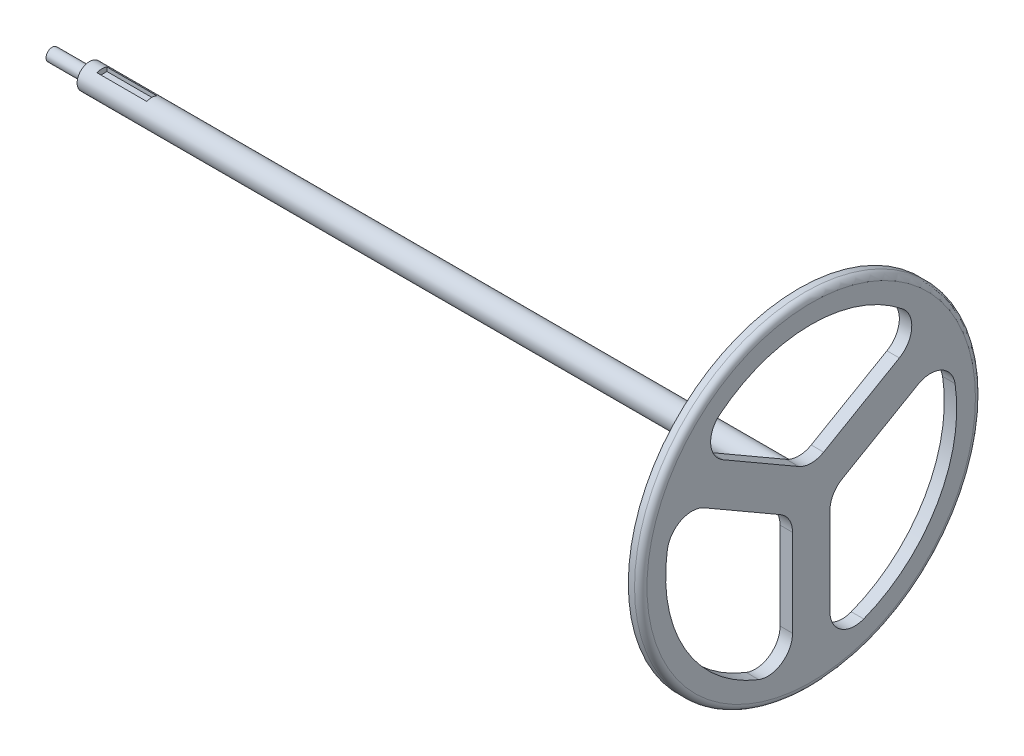
ISO-10303-21;
HEADER;
FILE_DESCRIPTION(('STEP AP214'),'2;1');
FILE_NAME('part.step','',(''),(''),'','','');
FILE_SCHEMA(('AUTOMOTIVE_DESIGN { 1 0 10303 214 1 1 1 1 }'));
ENDSEC;
DATA;
#1=APPLICATION_CONTEXT('core data for automotive mechanical design processes');
#2=APPLICATION_PROTOCOL_DEFINITION('international standard','automotive_design',2000,#1);
#3=PRODUCT_CONTEXT('',#1,'mechanical');
#4=PRODUCT('Part','Part','',(#3));
#5=PRODUCT_RELATED_PRODUCT_CATEGORY('part','',(#4));
#6=PRODUCT_DEFINITION_FORMATION('','',#4);
#7=PRODUCT_DEFINITION_CONTEXT('part definition',#1,'design');
#8=PRODUCT_DEFINITION('design','',#6,#7);
#9=PRODUCT_DEFINITION_SHAPE('','',#8);
#10=(LENGTH_UNIT() NAMED_UNIT(*) SI_UNIT(.MILLI.,.METRE.));
#11=(NAMED_UNIT(*) PLANE_ANGLE_UNIT() SI_UNIT($,.RADIAN.));
#12=(NAMED_UNIT(*) SI_UNIT($,.STERADIAN.) SOLID_ANGLE_UNIT());
#13=UNCERTAINTY_MEASURE_WITH_UNIT(LENGTH_MEASURE(1.E-05),#10,'distance_accuracy_value','');
#14=(GEOMETRIC_REPRESENTATION_CONTEXT(3) GLOBAL_UNCERTAINTY_ASSIGNED_CONTEXT((#13)) GLOBAL_UNIT_ASSIGNED_CONTEXT((#10,
#11,#12)) REPRESENTATION_CONTEXT('',''));
#15=CARTESIAN_POINT('',(0.,0.,0.));
#16=DIRECTION('',(0.,0.,1.));
#17=DIRECTION('',(1.,0.,0.));
#18=AXIS2_PLACEMENT_3D('',#15,#16,#17);
#19=CARTESIAN_POINT('',(-580.,0.,0.));
#20=DIRECTION('',(1.,0.,0.));
#21=DIRECTION('',(0.,0.,-1.));
#22=AXIS2_PLACEMENT_3D('',#19,#20,#21);
#23=CYLINDRICAL_SURFACE('',#22,10.);
#24=DIRECTION('',(1.,0.,0.));
#25=VECTOR('',#24,1.);
#26=CARTESIAN_POINT('',(-580.,9.16515138991168,-4.));
#27=LINE('',#26,#25);
#28=CARTESIAN_POINT('',(-530.,9.16515138991168,-4.));
#29=VERTEX_POINT('',#28);
#30=CARTESIAN_POINT('',(-570.,9.16515138991168,-4.));
#31=VERTEX_POINT('',#30);
#32=EDGE_CURVE('E382',#29,#31,#27,.F.);
#33=ORIENTED_EDGE('',*,*,#32,.F.);
#34=CARTESIAN_POINT('',(-530.,0.,0.));
#35=DIRECTION('',(-1.,0.,0.));
#36=DIRECTION('',(0.,0.,1.));
#37=AXIS2_PLACEMENT_3D('',#34,#35,#36);
#38=CIRCLE('',#37,10.);
#39=CARTESIAN_POINT('',(-530.,9.16515138991168,4.));
#40=VERTEX_POINT('',#39);
#41=EDGE_CURVE('E64',#29,#40,#38,.F.);
#42=ORIENTED_EDGE('',*,*,#41,.T.);
#43=DIRECTION('',(1.,0.,0.));
#44=VECTOR('',#43,1.);
#45=CARTESIAN_POINT('',(-580.,9.16515138991168,4.));
#46=LINE('',#45,#44);
#47=CARTESIAN_POINT('',(-570.,9.16515138991168,4.));
#48=VERTEX_POINT('',#47);
#49=EDGE_CURVE('E384',#48,#40,#46,.T.);
#50=ORIENTED_EDGE('',*,*,#49,.F.);
#51=CARTESIAN_POINT('',(-570.,0.,0.));
#52=DIRECTION('',(-1.,0.,0.));
#53=DIRECTION('',(0.,0.,1.));
#54=AXIS2_PLACEMENT_3D('',#51,#52,#53);
#55=CIRCLE('',#54,10.);
#56=EDGE_CURVE('E378',#31,#48,#55,.F.);
#57=ORIENTED_EDGE('',*,*,#56,.F.);
#58=EDGE_LOOP('',(#33,#42,#50,#57));
#59=FACE_BOUND('',#58,.T.);
#60=CARTESIAN_POINT('',(-580.,0.,0.));
#61=DIRECTION('',(1.,0.,0.));
#62=DIRECTION('',(0.,0.,-1.));
#63=AXIS2_PLACEMENT_3D('',#60,#61,#62);
#64=CIRCLE('',#63,10.);
#65=CARTESIAN_POINT('',(-580.,0.,-10.));
#66=VERTEX_POINT('',#65);
#67=EDGE_CURVE('E374',#66,#66,#64,.T.);
#68=ORIENTED_EDGE('',*,*,#67,.T.);
#69=EDGE_LOOP('',(#68));
#70=FACE_BOUND('',#69,.T.);
#71=CARTESIAN_POINT('',(-10.,0.,0.));
#72=DIRECTION('',(1.,0.,0.));
#73=DIRECTION('',(0.,0.,-1.));
#74=AXIS2_PLACEMENT_3D('',#71,#72,#73);
#75=CIRCLE('',#74,10.);
#76=CARTESIAN_POINT('',(-10.,0.,-10.));
#77=VERTEX_POINT('',#76);
#78=EDGE_CURVE('E221',#77,#77,#75,.T.);
#79=ORIENTED_EDGE('',*,*,#78,.F.);
#80=EDGE_LOOP('',(#79));
#81=FACE_BOUND('',#80,.T.);
#82=ADVANCED_FACE('F41',(#59,#70,#81),#23,.T.);
#83=CARTESIAN_POINT('',(-580.,0.,0.));
#84=DIRECTION('',(1.,0.,0.));
#85=DIRECTION('',(0.,0.,-1.));
#86=AXIS2_PLACEMENT_3D('',#83,#84,#85);
#87=PLANE('',#86);
#88=CARTESIAN_POINT('',(-580.,0.,0.));
#89=DIRECTION('',(-1.,0.,0.));
#90=DIRECTION('',(0.,0.,1.));
#91=AXIS2_PLACEMENT_3D('',#88,#89,#90);
#92=CIRCLE('',#91,5.);
#93=CARTESIAN_POINT('',(-580.,0.,5.));
#94=VERTEX_POINT('',#93);
#95=EDGE_CURVE('E375',#94,#94,#92,.T.);
#96=ORIENTED_EDGE('',*,*,#95,.F.);
#97=EDGE_LOOP('',(#96));
#98=FACE_BOUND('',#97,.T.);
#99=ORIENTED_EDGE('',*,*,#67,.F.);
#100=EDGE_LOOP('',(#99));
#101=FACE_BOUND('',#100,.T.);
#102=ADVANCED_FACE('F400',(#98,#101),#87,.F.);
#103=CARTESIAN_POINT('',(-610.,0.,0.));
#104=DIRECTION('',(1.,0.,0.));
#105=DIRECTION('',(0.,0.,-1.));
#106=AXIS2_PLACEMENT_3D('',#103,#104,#105);
#107=CYLINDRICAL_SURFACE('',#106,5.);
#108=CARTESIAN_POINT('',(-610.,0.,0.));
#109=DIRECTION('',(-1.,0.,0.));
#110=DIRECTION('',(0.,0.,1.));
#111=AXIS2_PLACEMENT_3D('',#108,#109,#110);
#112=CIRCLE('',#111,5.);
#113=CARTESIAN_POINT('',(-610.,0.,5.));
#114=VERTEX_POINT('',#113);
#115=EDGE_CURVE('E369',#114,#114,#112,.T.);
#116=ORIENTED_EDGE('',*,*,#115,.F.);
#117=EDGE_LOOP('',(#116));
#118=FACE_BOUND('',#117,.T.);
#119=ORIENTED_EDGE('',*,*,#95,.T.);
#120=EDGE_LOOP('',(#119));
#121=FACE_BOUND('',#120,.T.);
#122=ADVANCED_FACE('F407',(#118,#121),#107,.T.);
#123=CARTESIAN_POINT('',(-610.,0.,0.));
#124=DIRECTION('',(-1.,0.,0.));
#125=DIRECTION('',(0.,0.,1.));
#126=AXIS2_PLACEMENT_3D('',#123,#124,#125);
#127=PLANE('',#126);
#128=ORIENTED_EDGE('',*,*,#115,.T.);
#129=EDGE_LOOP('',(#128));
#130=FACE_BOUND('',#129,.T.);
#131=ADVANCED_FACE('F415',(#130),#127,.T.);
#132=CARTESIAN_POINT('',(-530.,14.,4.));
#133=DIRECTION('',(0.,0.,1.));
#134=DIRECTION('',(1.,0.,0.));
#135=AXIS2_PLACEMENT_3D('',#132,#133,#134);
#136=PLANE('',#135);
#137=ORIENTED_EDGE('',*,*,#49,.T.);
#138=DIRECTION('',(0.,1.,0.));
#139=VECTOR('',#138,1.);
#140=CARTESIAN_POINT('',(-530.,14.,4.));
#141=LINE('',#140,#139);
#142=CARTESIAN_POINT('',(-530.,6.,4.));
#143=VERTEX_POINT('',#142);
#144=EDGE_CURVE('E353',#143,#40,#141,.T.);
#145=ORIENTED_EDGE('',*,*,#144,.F.);
#146=DIRECTION('',(-1.,0.,0.));
#147=VECTOR('',#146,1.);
#148=CARTESIAN_POINT('',(-530.,6.,4.));
#149=LINE('',#148,#147);
#150=CARTESIAN_POINT('',(-570.,6.,4.));
#151=VERTEX_POINT('',#150);
#152=EDGE_CURVE('E367',#143,#151,#149,.T.);
#153=ORIENTED_EDGE('',*,*,#152,.T.);
#154=DIRECTION('',(0.,1.,0.));
#155=VECTOR('',#154,1.);
#156=CARTESIAN_POINT('',(-570.,14.,4.));
#157=LINE('',#156,#155);
#158=EDGE_CURVE('E319',#151,#48,#157,.T.);
#159=ORIENTED_EDGE('',*,*,#158,.T.);
#160=EDGE_LOOP('',(#137,#145,#153,#159));
#161=FACE_BOUND('',#160,.T.);
#162=ADVANCED_FACE('F419',(#161),#136,.F.);
#163=CARTESIAN_POINT('',(-530.,6.,-4.));
#164=DIRECTION('',(0.,-1.,0.));
#165=DIRECTION('',(0.,0.,-1.));
#166=AXIS2_PLACEMENT_3D('',#163,#164,#165);
#167=PLANE('',#166);
#168=DIRECTION('',(0.,0.,1.));
#169=VECTOR('',#168,1.);
#170=CARTESIAN_POINT('',(-570.,6.,-4.));
#171=LINE('',#170,#169);
#172=CARTESIAN_POINT('',(-570.,6.,-4.));
#173=VERTEX_POINT('',#172);
#174=EDGE_CURVE('E356',#173,#151,#171,.T.);
#175=ORIENTED_EDGE('',*,*,#174,.T.);
#176=ORIENTED_EDGE('',*,*,#152,.F.);
#177=DIRECTION('',(0.,0.,1.));
#178=VECTOR('',#177,1.);
#179=CARTESIAN_POINT('',(-530.,6.,-4.));
#180=LINE('',#179,#178);
#181=CARTESIAN_POINT('',(-530.,6.,-4.));
#182=VERTEX_POINT('',#181);
#183=EDGE_CURVE('E358',#182,#143,#180,.T.);
#184=ORIENTED_EDGE('',*,*,#183,.F.);
#185=DIRECTION('',(-1.,0.,0.));
#186=VECTOR('',#185,1.);
#187=CARTESIAN_POINT('',(-530.,6.,-4.));
#188=LINE('',#187,#186);
#189=EDGE_CURVE('E361',#182,#173,#188,.T.);
#190=ORIENTED_EDGE('',*,*,#189,.T.);
#191=EDGE_LOOP('',(#175,#176,#184,#190));
#192=FACE_BOUND('',#191,.T.);
#193=ADVANCED_FACE('F423',(#192),#167,.F.);
#194=CARTESIAN_POINT('',(-530.,14.,-4.));
#195=DIRECTION('',(0.,0.,-1.));
#196=DIRECTION('',(0.,1.,0.));
#197=AXIS2_PLACEMENT_3D('',#194,#195,#196);
#198=PLANE('',#197);
#199=ORIENTED_EDGE('',*,*,#32,.T.);
#200=DIRECTION('',(0.,-1.,0.));
#201=VECTOR('',#200,1.);
#202=CARTESIAN_POINT('',(-570.,14.,-4.));
#203=LINE('',#202,#201);
#204=EDGE_CURVE('E56',#31,#173,#203,.T.);
#205=ORIENTED_EDGE('',*,*,#204,.T.);
#206=ORIENTED_EDGE('',*,*,#189,.F.);
#207=DIRECTION('',(0.,-1.,0.));
#208=VECTOR('',#207,1.);
#209=CARTESIAN_POINT('',(-530.,14.,-4.));
#210=LINE('',#209,#208);
#211=EDGE_CURVE('E355',#29,#182,#210,.T.);
#212=ORIENTED_EDGE('',*,*,#211,.F.);
#213=EDGE_LOOP('',(#199,#205,#206,#212));
#214=FACE_BOUND('',#213,.T.);
#215=ADVANCED_FACE('F425',(#214),#198,.F.);
#216=CARTESIAN_POINT('',(-530.,0.,0.));
#217=DIRECTION('',(-1.,0.,0.));
#218=DIRECTION('',(0.,0.,1.));
#219=AXIS2_PLACEMENT_3D('',#216,#217,#218);
#220=PLANE('',#219);
#221=ORIENTED_EDGE('',*,*,#211,.T.);
#222=ORIENTED_EDGE('',*,*,#183,.T.);
#223=ORIENTED_EDGE('',*,*,#144,.T.);
#224=ORIENTED_EDGE('',*,*,#41,.F.);
#225=EDGE_LOOP('',(#221,#222,#223,#224));
#226=FACE_BOUND('',#225,.T.);
#227=ADVANCED_FACE('F428',(#226),#220,.T.);
#228=CARTESIAN_POINT('',(-570.,0.,0.));
#229=DIRECTION('',(-1.,0.,0.));
#230=DIRECTION('',(0.,0.,1.));
#231=AXIS2_PLACEMENT_3D('',#228,#229,#230);
#232=PLANE('',#231);
#233=ORIENTED_EDGE('',*,*,#56,.T.);
#234=ORIENTED_EDGE('',*,*,#158,.F.);
#235=ORIENTED_EDGE('',*,*,#174,.F.);
#236=ORIENTED_EDGE('',*,*,#204,.F.);
#237=EDGE_LOOP('',(#233,#234,#235,#236));
#238=FACE_BOUND('',#237,.T.);
#239=ADVANCED_FACE('F433',(#238),#232,.F.);
#240=CARTESIAN_POINT('',(-10.,0.,0.));
#241=DIRECTION('',(1.,0.,0.));
#242=DIRECTION('',(0.,0.,-1.));
#243=AXIS2_PLACEMENT_3D('',#240,#241,#242);
#244=CYLINDRICAL_SURFACE('',#243,117.);
#245=CARTESIAN_POINT('',(0.,0.,0.));
#246=DIRECTION('',(1.,0.,0.));
#247=DIRECTION('',(0.,0.,-1.));
#248=AXIS2_PLACEMENT_3D('',#245,#246,#247);
#249=CIRCLE('',#248,117.);
#250=CARTESIAN_POINT('',(0.,-109.118135811476,-42.2164948453608));
#251=VERTEX_POINT('',#250);
#252=CARTESIAN_POINT('',(0.,17.9985109109211,-115.607325049019));
#253=VERTEX_POINT('',#252);
#254=EDGE_CURVE('E298',#251,#253,#249,.T.);
#255=ORIENTED_EDGE('',*,*,#254,.T.);
#256=DIRECTION('',(1.,0.,0.));
#257=VECTOR('',#256,1.);
#258=CARTESIAN_POINT('',(-10.,17.9985109109211,-115.607325049019));
#259=LINE('',#258,#257);
#260=CARTESIAN_POINT('',(-10.,17.9985109109211,-115.607325049019));
#261=VERTEX_POINT('',#260);
#262=EDGE_CURVE('E316',#261,#253,#259,.T.);
#263=ORIENTED_EDGE('',*,*,#262,.F.);
#264=CARTESIAN_POINT('',(-10.,0.,0.));
#265=DIRECTION('',(1.,0.,0.));
#266=DIRECTION('',(0.,0.,-1.));
#267=AXIS2_PLACEMENT_3D('',#264,#265,#266);
#268=CIRCLE('',#267,117.);
#269=CARTESIAN_POINT('',(-10.,-109.118135811476,-42.2164948453608));
#270=VERTEX_POINT('',#269);
#271=EDGE_CURVE('E250',#270,#261,#268,.T.);
#272=ORIENTED_EDGE('',*,*,#271,.F.);
#273=DIRECTION('',(1.,0.,0.));
#274=VECTOR('',#273,1.);
#275=CARTESIAN_POINT('',(-10.,-109.118135811476,-42.2164948453608));
#276=LINE('',#275,#274);
#277=EDGE_CURVE('E328',#270,#251,#276,.T.);
#278=ORIENTED_EDGE('',*,*,#277,.T.);
#279=EDGE_LOOP('',(#255,#263,#272,#278));
#280=FACE_BOUND('',#279,.T.);
#281=ADVANCED_FACE('F435',(#280),#244,.F.);
#282=CARTESIAN_POINT('',(-10.,14.9218423791397,-95.8453891432035));
#283=DIRECTION('',(1.,0.,0.));
#284=DIRECTION('',(0.,0.,-1.));
#285=AXIS2_PLACEMENT_3D('',#282,#283,#284);
#286=CYLINDRICAL_SURFACE('',#285,20.);
#287=CARTESIAN_POINT('',(0.,14.9218423791397,-95.8453891432035));
#288=DIRECTION('',(1.,0.,0.));
#289=DIRECTION('',(0.,0.,-1.));
#290=AXIS2_PLACEMENT_3D('',#287,#288,#289);
#291=CIRCLE('',#290,20.);
#292=CARTESIAN_POINT('',(0.,32.2423504548284,-85.8453891432034));
#293=VERTEX_POINT('',#292);
#294=EDGE_CURVE('E313',#253,#293,#291,.T.);
#295=ORIENTED_EDGE('',*,*,#294,.T.);
#296=DIRECTION('',(1.,0.,0.));
#297=VECTOR('',#296,1.);
#298=CARTESIAN_POINT('',(-10.,32.2423504548284,-85.8453891432034));
#299=LINE('',#298,#297);
#300=CARTESIAN_POINT('',(-10.,32.2423504548284,-85.8453891432034));
#301=VERTEX_POINT('',#300);
#302=EDGE_CURVE('E320',#301,#293,#299,.T.);
#303=ORIENTED_EDGE('',*,*,#302,.F.);
#304=CARTESIAN_POINT('',(-10.,14.9218423791397,-95.8453891432035));
#305=DIRECTION('',(1.,0.,0.));
#306=DIRECTION('',(0.,0.,-1.));
#307=AXIS2_PLACEMENT_3D('',#304,#305,#306);
#308=CIRCLE('',#307,20.);
#309=EDGE_CURVE('E202',#261,#301,#308,.T.);
#310=ORIENTED_EDGE('',*,*,#309,.F.);
#311=ORIENTED_EDGE('',*,*,#262,.T.);
#312=EDGE_LOOP('',(#295,#303,#310,#311));
#313=FACE_BOUND('',#312,.T.);
#314=ADVANCED_FACE('F489',(#313),#286,.F.);
#315=CARTESIAN_POINT('',(-10.,-12.9903810567665,-7.50000000000007));
#316=DIRECTION('',(0.,-0.866025403784436,-0.500000000000004));
#317=DIRECTION('',(0.,0.500000000000004,-0.866025403784436));
#318=AXIS2_PLACEMENT_3D('',#315,#316,#317);
#319=PLANE('',#318);
#320=DIRECTION('',(0.,0.500000000000004,-0.866025403784436));
#321=VECTOR('',#320,1.);
#322=CARTESIAN_POINT('',(0.,-12.9903810567665,-7.50000000000007));
#323=LINE('',#322,#321);
#324=CARTESIAN_POINT('',(0.,-2.88675134594807,-24.9999999999999));
#325=VERTEX_POINT('',#324);
#326=EDGE_CURVE('E310',#325,#293,#323,.T.);
#327=ORIENTED_EDGE('',*,*,#326,.F.);
#328=DIRECTION('',(1.,0.,0.));
#329=VECTOR('',#328,1.);
#330=CARTESIAN_POINT('',(-10.,-2.88675134594807,-24.9999999999999));
#331=LINE('',#330,#329);
#332=CARTESIAN_POINT('',(-10.,-2.88675134594807,-24.9999999999999));
#333=VERTEX_POINT('',#332);
#334=EDGE_CURVE('E322',#333,#325,#331,.T.);
#335=ORIENTED_EDGE('',*,*,#334,.F.);
#336=DIRECTION('',(0.,0.500000000000004,-0.866025403784436));
#337=VECTOR('',#336,1.);
#338=CARTESIAN_POINT('',(-10.,-12.9903810567665,-7.50000000000007));
#339=LINE('',#338,#337);
#340=EDGE_CURVE('E261',#333,#301,#339,.T.);
#341=ORIENTED_EDGE('',*,*,#340,.T.);
#342=ORIENTED_EDGE('',*,*,#302,.T.);
#343=EDGE_LOOP('',(#327,#335,#341,#342));
#344=FACE_BOUND('',#343,.T.);
#345=ADVANCED_FACE('F500',(#344),#319,.T.);
#346=CARTESIAN_POINT('',(-10.,-20.2072594216368,-35.));
#347=DIRECTION('',(1.,0.,0.));
#348=DIRECTION('',(0.,0.,-1.));
#349=AXIS2_PLACEMENT_3D('',#346,#347,#348);
#350=CYLINDRICAL_SURFACE('',#349,20.);
#351=CARTESIAN_POINT('',(0.,-20.2072594216368,-35.));
#352=DIRECTION('',(1.,0.,0.));
#353=DIRECTION('',(0.,0.,-1.));
#354=AXIS2_PLACEMENT_3D('',#351,#352,#353);
#355=CIRCLE('',#354,20.);
#356=CARTESIAN_POINT('',(0.,-20.2072594216368,-15.));
#357=VERTEX_POINT('',#356);
#358=EDGE_CURVE('E307',#357,#325,#355,.F.);
#359=ORIENTED_EDGE('',*,*,#358,.F.);
#360=DIRECTION('',(1.,0.,0.));
#361=VECTOR('',#360,1.);
#362=CARTESIAN_POINT('',(-10.,-20.2072594216368,-15.));
#363=LINE('',#362,#361);
#364=CARTESIAN_POINT('',(-10.,-20.2072594216368,-15.));
#365=VERTEX_POINT('',#364);
#366=EDGE_CURVE('E324',#365,#357,#363,.T.);
#367=ORIENTED_EDGE('',*,*,#366,.F.);
#368=CARTESIAN_POINT('',(-10.,-20.2072594216368,-35.));
#369=DIRECTION('',(1.,0.,0.));
#370=DIRECTION('',(0.,0.,-1.));
#371=AXIS2_PLACEMENT_3D('',#368,#369,#370);
#372=CIRCLE('',#371,20.);
#373=EDGE_CURVE('E258',#365,#333,#372,.F.);
#374=ORIENTED_EDGE('',*,*,#373,.T.);
#375=ORIENTED_EDGE('',*,*,#334,.T.);
#376=EDGE_LOOP('',(#359,#367,#374,#375));
#377=FACE_BOUND('',#376,.T.);
#378=ADVANCED_FACE('F496',(#377),#350,.F.);
#379=CARTESIAN_POINT('',(-10.,0.,-15.));
#380=DIRECTION('',(0.,0.,1.));
#381=DIRECTION('',(0.,-1.,0.));
#382=AXIS2_PLACEMENT_3D('',#379,#380,#381);
#383=PLANE('',#382);
#384=DIRECTION('',(0.,-1.,0.));
#385=VECTOR('',#384,1.);
#386=CARTESIAN_POINT('',(0.,0.,-15.));
#387=LINE('',#386,#385);
#388=CARTESIAN_POINT('',(0.,-90.4654630231891,-15.));
#389=VERTEX_POINT('',#388);
#390=EDGE_CURVE('E304',#357,#389,#387,.T.);
#391=ORIENTED_EDGE('',*,*,#390,.T.);
#392=DIRECTION('',(1.,0.,0.));
#393=VECTOR('',#392,1.);
#394=CARTESIAN_POINT('',(-10.,-90.4654630231891,-15.));
#395=LINE('',#394,#393);
#396=CARTESIAN_POINT('',(-10.,-90.4654630231891,-15.));
#397=VERTEX_POINT('',#396);
#398=EDGE_CURVE('E326',#397,#389,#395,.T.);
#399=ORIENTED_EDGE('',*,*,#398,.F.);
#400=DIRECTION('',(0.,-1.,0.));
#401=VECTOR('',#400,1.);
#402=CARTESIAN_POINT('',(-10.,0.,-15.));
#403=LINE('',#402,#401);
#404=EDGE_CURVE('E256',#365,#397,#403,.T.);
#405=ORIENTED_EDGE('',*,*,#404,.F.);
#406=ORIENTED_EDGE('',*,*,#366,.T.);
#407=EDGE_LOOP('',(#391,#399,#405,#406));
#408=FACE_BOUND('',#407,.T.);
#409=ADVANCED_FACE('F469',(#408),#383,.F.);
#410=CARTESIAN_POINT('',(-10.,0.,15.));
#411=DIRECTION('',(0.,0.,1.));
#412=DIRECTION('',(0.,-1.,0.));
#413=AXIS2_PLACEMENT_3D('',#410,#411,#412);
#414=PLANE('',#413);
#415=DIRECTION('',(0.,-1.,0.));
#416=VECTOR('',#415,1.);
#417=CARTESIAN_POINT('',(0.,0.,15.));
#418=LINE('',#417,#416);
#419=CARTESIAN_POINT('',(0.,-20.2072594216371,15.));
#420=VERTEX_POINT('',#419);
#421=CARTESIAN_POINT('',(0.,-90.4654630231891,15.));
#422=VERTEX_POINT('',#421);
#423=EDGE_CURVE('E280',#420,#422,#418,.T.);
#424=ORIENTED_EDGE('',*,*,#423,.F.);
#425=DIRECTION('',(1.,0.,0.));
#426=VECTOR('',#425,1.);
#427=CARTESIAN_POINT('',(-10.,-20.2072594216371,15.));
#428=LINE('',#427,#426);
#429=CARTESIAN_POINT('',(-10.,-20.2072594216371,15.));
#430=VERTEX_POINT('',#429);
#431=EDGE_CURVE('E330',#430,#420,#428,.T.);
#432=ORIENTED_EDGE('',*,*,#431,.F.);
#433=DIRECTION('',(0.,-1.,0.));
#434=VECTOR('',#433,1.);
#435=CARTESIAN_POINT('',(-10.,0.,15.));
#436=LINE('',#435,#434);
#437=CARTESIAN_POINT('',(-10.,-90.4654630231891,15.));
#438=VERTEX_POINT('',#437);
#439=EDGE_CURVE('E233',#430,#438,#436,.T.);
#440=ORIENTED_EDGE('',*,*,#439,.T.);
#441=DIRECTION('',(1.,0.,0.));
#442=VECTOR('',#441,1.);
#443=CARTESIAN_POINT('',(-10.,-90.4654630231891,15.));
#444=LINE('',#443,#442);
#445=EDGE_CURVE('E343',#438,#422,#444,.T.);
#446=ORIENTED_EDGE('',*,*,#445,.T.);
#447=EDGE_LOOP('',(#424,#432,#440,#446));
#448=FACE_BOUND('',#447,.T.);
#449=ADVANCED_FACE('F465',(#448),#414,.T.);
#450=CARTESIAN_POINT('',(-10.,-20.2072594216371,35.));
#451=DIRECTION('',(1.,0.,0.));
#452=DIRECTION('',(0.,0.,-1.));
#453=AXIS2_PLACEMENT_3D('',#450,#451,#452);
#454=CYLINDRICAL_SURFACE('',#453,20.);
#455=CARTESIAN_POINT('',(0.,-20.2072594216371,35.));
#456=DIRECTION('',(1.,0.,0.));
#457=DIRECTION('',(0.,0.,-1.));
#458=AXIS2_PLACEMENT_3D('',#455,#456,#457);
#459=CIRCLE('',#458,20.);
#460=CARTESIAN_POINT('',(0.,-2.88675134594826,25.0000000000002));
#461=VERTEX_POINT('',#460);
#462=EDGE_CURVE('E295',#420,#461,#459,.T.);
#463=ORIENTED_EDGE('',*,*,#462,.T.);
#464=DIRECTION('',(1.,0.,0.));
#465=VECTOR('',#464,1.);
#466=CARTESIAN_POINT('',(-10.,-2.88675134594826,25.0000000000002));
#467=LINE('',#466,#465);
#468=CARTESIAN_POINT('',(-10.,-2.88675134594826,25.0000000000002));
#469=VERTEX_POINT('',#468);
#470=EDGE_CURVE('E332',#469,#461,#467,.T.);
#471=ORIENTED_EDGE('',*,*,#470,.F.);
#472=CARTESIAN_POINT('',(-10.,-20.2072594216371,35.));
#473=DIRECTION('',(1.,0.,0.));
#474=DIRECTION('',(0.,0.,-1.));
#475=AXIS2_PLACEMENT_3D('',#472,#473,#474);
#476=CIRCLE('',#475,20.);
#477=EDGE_CURVE('E247',#430,#469,#476,.T.);
#478=ORIENTED_EDGE('',*,*,#477,.F.);
#479=ORIENTED_EDGE('',*,*,#431,.T.);
#480=EDGE_LOOP('',(#463,#471,#478,#479));
#481=FACE_BOUND('',#480,.T.);
#482=ADVANCED_FACE('F468',(#481),#454,.F.);
#483=CARTESIAN_POINT('',(-10.,-12.9903810567667,7.49999999999987));
#484=DIRECTION('',(0.,0.866025403784444,-0.499999999999991));
#485=DIRECTION('',(0.,0.499999999999991,0.866025403784444));
#486=AXIS2_PLACEMENT_3D('',#483,#484,#485);
#487=PLANE('',#486);
#488=DIRECTION('',(0.,0.499999999999991,0.866025403784444));
#489=VECTOR('',#488,1.);
#490=CARTESIAN_POINT('',(0.,-12.9903810567667,7.49999999999987));
#491=LINE('',#490,#489);
#492=CARTESIAN_POINT('',(0.,32.2423504548272,85.8453891432039));
#493=VERTEX_POINT('',#492);
#494=EDGE_CURVE('E292',#461,#493,#491,.T.);
#495=ORIENTED_EDGE('',*,*,#494,.T.);
#496=DIRECTION('',(1.,0.,0.));
#497=VECTOR('',#496,1.);
#498=CARTESIAN_POINT('',(-10.,32.2423504548272,85.8453891432039));
#499=LINE('',#498,#497);
#500=CARTESIAN_POINT('',(-10.,32.2423504548272,85.8453891432039));
#501=VERTEX_POINT('',#500);
#502=EDGE_CURVE('E335',#501,#493,#499,.T.);
#503=ORIENTED_EDGE('',*,*,#502,.F.);
#504=DIRECTION('',(0.,0.499999999999991,0.866025403784444));
#505=VECTOR('',#504,1.);
#506=CARTESIAN_POINT('',(-10.,-12.9903810567667,7.49999999999987));
#507=LINE('',#506,#505);
#508=EDGE_CURVE('E244',#469,#501,#507,.T.);
#509=ORIENTED_EDGE('',*,*,#508,.F.);
#510=ORIENTED_EDGE('',*,*,#470,.T.);
#511=EDGE_LOOP('',(#495,#503,#509,#510));
#512=FACE_BOUND('',#511,.T.);
#513=ADVANCED_FACE('F480',(#512),#487,.F.);
#514=CARTESIAN_POINT('',(-10.,14.9218423791383,95.8453891432037));
#515=DIRECTION('',(1.,0.,0.));
#516=DIRECTION('',(0.,0.,-1.));
#517=AXIS2_PLACEMENT_3D('',#514,#515,#516);
#518=CYLINDRICAL_SURFACE('',#517,20.);
#519=CARTESIAN_POINT('',(0.,14.9218423791383,95.8453891432037));
#520=DIRECTION('',(1.,0.,0.));
#521=DIRECTION('',(0.,0.,-1.));
#522=AXIS2_PLACEMENT_3D('',#519,#520,#521);
#523=CIRCLE('',#522,20.);
#524=CARTESIAN_POINT('',(0.,17.9985109109193,115.607325049019));
#525=VERTEX_POINT('',#524);
#526=EDGE_CURVE('E289',#493,#525,#523,.T.);
#527=ORIENTED_EDGE('',*,*,#526,.T.);
#528=DIRECTION('',(1.,0.,0.));
#529=VECTOR('',#528,1.);
#530=CARTESIAN_POINT('',(-10.,17.9985109109193,115.607325049019));
#531=LINE('',#530,#529);
#532=CARTESIAN_POINT('',(-10.,17.9985109109193,115.607325049019));
#533=VERTEX_POINT('',#532);
#534=EDGE_CURVE('E338',#533,#525,#531,.T.);
#535=ORIENTED_EDGE('',*,*,#534,.F.);
#536=CARTESIAN_POINT('',(-10.,14.9218423791383,95.8453891432037));
#537=DIRECTION('',(1.,0.,0.));
#538=DIRECTION('',(0.,0.,-1.));
#539=AXIS2_PLACEMENT_3D('',#536,#537,#538);
#540=CIRCLE('',#539,20.);
#541=EDGE_CURVE('E241',#501,#533,#540,.T.);
#542=ORIENTED_EDGE('',*,*,#541,.F.);
#543=ORIENTED_EDGE('',*,*,#502,.T.);
#544=EDGE_LOOP('',(#527,#535,#542,#543));
#545=FACE_BOUND('',#544,.T.);
#546=ADVANCED_FACE('F476',(#545),#518,.F.);
#547=CARTESIAN_POINT('',(-10.,0.,0.));
#548=DIRECTION('',(1.,0.,0.));
#549=DIRECTION('',(0.,0.,-1.));
#550=AXIS2_PLACEMENT_3D('',#547,#548,#549);
#551=CYLINDRICAL_SURFACE('',#550,117.);
#552=CARTESIAN_POINT('',(0.,0.,0.));
#553=DIRECTION('',(1.,0.,0.));
#554=DIRECTION('',(0.,0.,-1.));
#555=AXIS2_PLACEMENT_3D('',#552,#553,#554);
#556=CIRCLE('',#555,117.);
#557=CARTESIAN_POINT('',(0.,-109.118135811476,42.2164948453609));
#558=VERTEX_POINT('',#557);
#559=EDGE_CURVE('E286',#525,#558,#556,.T.);
#560=ORIENTED_EDGE('',*,*,#559,.T.);
#561=DIRECTION('',(1.,0.,0.));
#562=VECTOR('',#561,1.);
#563=CARTESIAN_POINT('',(-10.,-109.118135811476,42.2164948453609));
#564=LINE('',#563,#562);
#565=CARTESIAN_POINT('',(-10.,-109.118135811476,42.2164948453609));
#566=VERTEX_POINT('',#565);
#567=EDGE_CURVE('E341',#566,#558,#564,.T.);
#568=ORIENTED_EDGE('',*,*,#567,.F.);
#569=CARTESIAN_POINT('',(-10.,0.,0.));
#570=DIRECTION('',(1.,0.,0.));
#571=DIRECTION('',(0.,0.,-1.));
#572=AXIS2_PLACEMENT_3D('',#569,#570,#571);
#573=CIRCLE('',#572,117.);
#574=EDGE_CURVE('E239',#533,#566,#573,.T.);
#575=ORIENTED_EDGE('',*,*,#574,.F.);
#576=ORIENTED_EDGE('',*,*,#534,.T.);
#577=EDGE_LOOP('',(#560,#568,#575,#576));
#578=FACE_BOUND('',#577,.T.);
#579=ADVANCED_FACE('F446',(#578),#551,.F.);
#580=CARTESIAN_POINT('',(-10.,12.9903810567667,-7.49999999999987));
#581=DIRECTION('',(0.,0.866025403784444,-0.499999999999991));
#582=DIRECTION('',(0.,0.499999999999991,0.866025403784444));
#583=AXIS2_PLACEMENT_3D('',#580,#581,#582);
#584=PLANE('',#583);
#585=DIRECTION('',(0.,0.499999999999991,0.866025403784444));
#586=VECTOR('',#585,1.);
#587=CARTESIAN_POINT('',(0.,12.9903810567667,-7.49999999999987));
#588=LINE('',#587,#586);
#589=CARTESIAN_POINT('',(0.,23.0940107675849,10.0000000000001));
#590=VERTEX_POINT('',#589);
#591=CARTESIAN_POINT('',(0.,58.2231125683604,70.8453891432042));
#592=VERTEX_POINT('',#591);
#593=EDGE_CURVE('E265',#590,#592,#588,.T.);
#594=ORIENTED_EDGE('',*,*,#593,.F.);
#595=DIRECTION('',(1.,0.,0.));
#596=VECTOR('',#595,1.);
#597=CARTESIAN_POINT('',(-10.,23.0940107675849,10.0000000000001));
#598=LINE('',#597,#596);
#599=CARTESIAN_POINT('',(-10.,23.0940107675849,10.0000000000001));
#600=VERTEX_POINT('',#599);
#601=EDGE_CURVE('E217',#600,#590,#598,.T.);
#602=ORIENTED_EDGE('',*,*,#601,.F.);
#603=DIRECTION('',(0.,0.499999999999991,0.866025403784444));
#604=VECTOR('',#603,1.);
#605=CARTESIAN_POINT('',(-10.,12.9903810567667,-7.49999999999987));
#606=LINE('',#605,#604);
#607=CARTESIAN_POINT('',(-10.,58.2231125683604,70.8453891432042));
#608=VERTEX_POINT('',#607);
#609=EDGE_CURVE('E209',#600,#608,#606,.T.);
#610=ORIENTED_EDGE('',*,*,#609,.T.);
#611=DIRECTION('',(1.,0.,0.));
#612=VECTOR('',#611,1.);
#613=CARTESIAN_POINT('',(-10.,58.2231125683604,70.8453891432042));
#614=LINE('',#613,#612);
#615=EDGE_CURVE('E191',#608,#592,#614,.T.);
#616=ORIENTED_EDGE('',*,*,#615,.T.);
#617=EDGE_LOOP('',(#594,#602,#610,#616));
#618=FACE_BOUND('',#617,.T.);
#619=ADVANCED_FACE('F216',(#618),#584,.T.);
#620=CARTESIAN_POINT('',(-10.,40.4145188432737,3.03576608295941E-13));
#621=DIRECTION('',(1.,0.,0.));
#622=DIRECTION('',(0.,0.,-1.));
#623=AXIS2_PLACEMENT_3D('',#620,#621,#622);
#624=CYLINDRICAL_SURFACE('',#623,20.);
#625=CARTESIAN_POINT('',(0.,40.4145188432737,3.03576608295941E-13));
#626=DIRECTION('',(1.,0.,0.));
#627=DIRECTION('',(0.,0.,-1.));
#628=AXIS2_PLACEMENT_3D('',#625,#626,#627);
#629=CIRCLE('',#628,20.);
#630=CARTESIAN_POINT('',(0.,23.094010767585,-9.99999999999978));
#631=VERTEX_POINT('',#630);
#632=EDGE_CURVE('E277',#631,#590,#629,.F.);
#633=ORIENTED_EDGE('',*,*,#632,.F.);
#634=DIRECTION('',(1.,0.,0.));
#635=VECTOR('',#634,1.);
#636=CARTESIAN_POINT('',(-10.,23.094010767585,-9.99999999999978));
#637=LINE('',#636,#635);
#638=CARTESIAN_POINT('',(-10.,23.094010767585,-9.99999999999978));
#639=VERTEX_POINT('',#638);
#640=EDGE_CURVE('E346',#639,#631,#637,.T.);
#641=ORIENTED_EDGE('',*,*,#640,.F.);
#642=CARTESIAN_POINT('',(-10.,40.4145188432737,3.03576608295941E-13));
#643=DIRECTION('',(1.,0.,0.));
#644=DIRECTION('',(0.,0.,-1.));
#645=AXIS2_PLACEMENT_3D('',#642,#643,#644);
#646=CIRCLE('',#645,20.);
#647=EDGE_CURVE('E231',#639,#600,#646,.F.);
#648=ORIENTED_EDGE('',*,*,#647,.T.);
#649=ORIENTED_EDGE('',*,*,#601,.T.);
#650=EDGE_LOOP('',(#633,#641,#648,#649));
#651=FACE_BOUND('',#650,.T.);
#652=ADVANCED_FACE('F445',(#651),#624,.F.);
#653=CARTESIAN_POINT('',(-10.,12.9903810567665,7.50000000000006));
#654=DIRECTION('',(0.,-0.866025403784436,-0.500000000000004));
#655=DIRECTION('',(0.,0.500000000000004,-0.866025403784436));
#656=AXIS2_PLACEMENT_3D('',#653,#654,#655);
#657=PLANE('',#656);
#658=DIRECTION('',(0.,0.500000000000004,-0.866025403784436));
#659=VECTOR('',#658,1.);
#660=CARTESIAN_POINT('',(0.,12.9903810567665,7.50000000000006));
#661=LINE('',#660,#659);
#662=CARTESIAN_POINT('',(0.,58.2231125683615,-70.8453891432033));
#663=VERTEX_POINT('',#662);
#664=EDGE_CURVE('E274',#631,#663,#661,.T.);
#665=ORIENTED_EDGE('',*,*,#664,.T.);
#666=DIRECTION('',(1.,0.,0.));
#667=VECTOR('',#666,1.);
#668=CARTESIAN_POINT('',(-10.,58.2231125683615,-70.8453891432033));
#669=LINE('',#668,#667);
#670=CARTESIAN_POINT('',(-10.,58.2231125683615,-70.8453891432033));
#671=VERTEX_POINT('',#670);
#672=EDGE_CURVE('E348',#671,#663,#669,.T.);
#673=ORIENTED_EDGE('',*,*,#672,.F.);
#674=DIRECTION('',(0.,0.500000000000004,-0.866025403784436));
#675=VECTOR('',#674,1.);
#676=CARTESIAN_POINT('',(-10.,12.9903810567665,7.50000000000006));
#677=LINE('',#676,#675);
#678=EDGE_CURVE('E229',#639,#671,#677,.T.);
#679=ORIENTED_EDGE('',*,*,#678,.F.);
#680=ORIENTED_EDGE('',*,*,#640,.T.);
#681=EDGE_LOOP('',(#665,#673,#679,#680));
#682=FACE_BOUND('',#681,.T.);
#683=ADVANCED_FACE('F457',(#682),#657,.F.);
#684=CARTESIAN_POINT('',(-10.,75.5436206440502,-60.8453891432032));
#685=DIRECTION('',(1.,0.,0.));
#686=DIRECTION('',(0.,0.,-1.));
#687=AXIS2_PLACEMENT_3D('',#684,#685,#686);
#688=CYLINDRICAL_SURFACE('',#687,20.);
#689=CARTESIAN_POINT('',(0.,75.5436206440502,-60.8453891432032));
#690=DIRECTION('',(1.,0.,0.));
#691=DIRECTION('',(0.,0.,-1.));
#692=AXIS2_PLACEMENT_3D('',#689,#690,#691);
#693=CIRCLE('',#692,20.);
#694=CARTESIAN_POINT('',(0.,91.1196249005554,-73.3908302036575));
#695=VERTEX_POINT('',#694);
#696=EDGE_CURVE('E271',#695,#663,#693,.F.);
#697=ORIENTED_EDGE('',*,*,#696,.F.);
#698=DIRECTION('',(1.,0.,0.));
#699=VECTOR('',#698,1.);
#700=CARTESIAN_POINT('',(-10.,91.1196249005554,-73.3908302036575));
#701=LINE('',#700,#699);
#702=CARTESIAN_POINT('',(-10.,91.1196249005554,-73.3908302036575));
#703=VERTEX_POINT('',#702);
#704=EDGE_CURVE('E350',#703,#695,#701,.T.);
#705=ORIENTED_EDGE('',*,*,#704,.F.);
#706=CARTESIAN_POINT('',(-10.,75.5436206440502,-60.8453891432032));
#707=DIRECTION('',(1.,0.,0.));
#708=DIRECTION('',(0.,0.,-1.));
#709=AXIS2_PLACEMENT_3D('',#706,#707,#708);
#710=CIRCLE('',#709,20.);
#711=EDGE_CURVE('E226',#703,#671,#710,.F.);
#712=ORIENTED_EDGE('',*,*,#711,.T.);
#713=ORIENTED_EDGE('',*,*,#672,.T.);
#714=EDGE_LOOP('',(#697,#705,#712,#713));
#715=FACE_BOUND('',#714,.T.);
#716=ADVANCED_FACE('F453',(#715),#688,.F.);
#717=CARTESIAN_POINT('',(-10.,0.,0.));
#718=DIRECTION('',(1.,0.,0.));
#719=DIRECTION('',(0.,0.,-1.));
#720=AXIS2_PLACEMENT_3D('',#717,#718,#719);
#721=CYLINDRICAL_SURFACE('',#720,117.);
#722=CARTESIAN_POINT('',(0.,0.,0.));
#723=DIRECTION('',(1.,0.,0.));
#724=DIRECTION('',(0.,0.,-1.));
#725=AXIS2_PLACEMENT_3D('',#722,#723,#724);
#726=CIRCLE('',#725,117.);
#727=CARTESIAN_POINT('',(0.,91.1196249005543,73.3908302036589));
#728=VERTEX_POINT('',#727);
#729=EDGE_CURVE('E268',#695,#728,#726,.T.);
#730=ORIENTED_EDGE('',*,*,#729,.T.);
#731=DIRECTION('',(1.,0.,0.));
#732=VECTOR('',#731,1.);
#733=CARTESIAN_POINT('',(-10.,91.1196249005543,73.3908302036589));
#734=LINE('',#733,#732);
#735=CARTESIAN_POINT('',(-10.,91.1196249005543,73.3908302036589));
#736=VERTEX_POINT('',#735);
#737=EDGE_CURVE('E201',#736,#728,#734,.T.);
#738=ORIENTED_EDGE('',*,*,#737,.F.);
#739=CARTESIAN_POINT('',(-10.,0.,0.));
#740=DIRECTION('',(1.,0.,0.));
#741=DIRECTION('',(0.,0.,-1.));
#742=AXIS2_PLACEMENT_3D('',#739,#740,#741);
#743=CIRCLE('',#742,117.);
#744=EDGE_CURVE('E213',#703,#736,#743,.T.);
#745=ORIENTED_EDGE('',*,*,#744,.F.);
#746=ORIENTED_EDGE('',*,*,#704,.T.);
#747=EDGE_LOOP('',(#730,#738,#745,#746));
#748=FACE_BOUND('',#747,.T.);
#749=ADVANCED_FACE('F450',(#748),#721,.F.);
#750=CARTESIAN_POINT('',(-10.,-90.4654630231891,35.));
#751=DIRECTION('',(1.,0.,0.));
#752=DIRECTION('',(0.,0.,-1.));
#753=AXIS2_PLACEMENT_3D('',#750,#751,#752);
#754=CYLINDRICAL_SURFACE('',#753,20.);
#755=CARTESIAN_POINT('',(0.,-90.4654630231891,35.));
#756=DIRECTION('',(1.,0.,0.));
#757=DIRECTION('',(0.,0.,-1.));
#758=AXIS2_PLACEMENT_3D('',#755,#756,#757);
#759=CIRCLE('',#758,20.);
#760=EDGE_CURVE('E283',#422,#558,#759,.F.);
#761=ORIENTED_EDGE('',*,*,#760,.F.);
#762=ORIENTED_EDGE('',*,*,#445,.F.);
#763=CARTESIAN_POINT('',(-10.,-90.4654630231891,35.));
#764=DIRECTION('',(1.,0.,0.));
#765=DIRECTION('',(0.,0.,-1.));
#766=AXIS2_PLACEMENT_3D('',#763,#764,#765);
#767=CIRCLE('',#766,20.);
#768=EDGE_CURVE('E236',#438,#566,#767,.F.);
#769=ORIENTED_EDGE('',*,*,#768,.T.);
#770=ORIENTED_EDGE('',*,*,#567,.T.);
#771=EDGE_LOOP('',(#761,#762,#769,#770));
#772=FACE_BOUND('',#771,.T.);
#773=ADVANCED_FACE('F449',(#772),#754,.F.);
#774=CARTESIAN_POINT('',(-10.,75.5436206440493,60.8453891432043));
#775=DIRECTION('',(1.,0.,0.));
#776=DIRECTION('',(0.,0.,-1.));
#777=AXIS2_PLACEMENT_3D('',#774,#775,#776);
#778=CYLINDRICAL_SURFACE('',#777,20.);
#779=CARTESIAN_POINT('',(0.,75.5436206440493,60.8453891432043));
#780=DIRECTION('',(1.,0.,0.));
#781=DIRECTION('',(0.,0.,-1.));
#782=AXIS2_PLACEMENT_3D('',#779,#780,#781);
#783=CIRCLE('',#782,20.);
#784=EDGE_CURVE('E196',#592,#728,#783,.F.);
#785=ORIENTED_EDGE('',*,*,#784,.F.);
#786=ORIENTED_EDGE('',*,*,#615,.F.);
#787=CARTESIAN_POINT('',(-10.,75.5436206440493,60.8453891432043));
#788=DIRECTION('',(1.,0.,0.));
#789=DIRECTION('',(0.,0.,-1.));
#790=AXIS2_PLACEMENT_3D('',#787,#788,#789);
#791=CIRCLE('',#790,20.);
#792=EDGE_CURVE('E194',#608,#736,#791,.F.);
#793=ORIENTED_EDGE('',*,*,#792,.T.);
#794=ORIENTED_EDGE('',*,*,#737,.T.);
#795=EDGE_LOOP('',(#785,#786,#793,#794));
#796=FACE_BOUND('',#795,.T.);
#797=ADVANCED_FACE('F193',(#796),#778,.F.);
#798=CARTESIAN_POINT('',(-10.,0.,0.));
#799=DIRECTION('',(1.,0.,0.));
#800=DIRECTION('',(0.,0.,-1.));
#801=AXIS2_PLACEMENT_3D('',#798,#799,#800);
#802=CYLINDRICAL_SURFACE('',#801,137.);
#803=CARTESIAN_POINT('',(-5.,0.,0.));
#804=DIRECTION('',(1.,0.,0.));
#805=DIRECTION('',(0.,0.,-1.));
#806=AXIS2_PLACEMENT_3D('',#803,#804,#805);
#807=CIRCLE('',#806,137.);
#808=CARTESIAN_POINT('',(-5.,0.,-137.));
#809=VERTEX_POINT('',#808);
#810=EDGE_CURVE('E11',#809,#809,#807,.F.);
#811=ORIENTED_EDGE('',*,*,#810,.T.);
#812=EDGE_LOOP('',(#811));
#813=FACE_BOUND('',#812,.T.);
#814=CARTESIAN_POINT('',(-10.,0.,0.));
#815=DIRECTION('',(1.,0.,0.));
#816=DIRECTION('',(0.,0.,-1.));
#817=AXIS2_PLACEMENT_3D('',#814,#815,#816);
#818=CIRCLE('',#817,137.);
#819=CARTESIAN_POINT('',(-10.,0.,-137.));
#820=VERTEX_POINT('',#819);
#821=EDGE_CURVE('E218',#820,#820,#818,.T.);
#822=ORIENTED_EDGE('',*,*,#821,.T.);
#823=EDGE_LOOP('',(#822));
#824=FACE_BOUND('',#823,.T.);
#825=ADVANCED_FACE('F438',(#813,#824),#802,.T.);
#826=CARTESIAN_POINT('',(-10.,-90.4654630231891,-35.));
#827=DIRECTION('',(1.,0.,0.));
#828=DIRECTION('',(0.,0.,-1.));
#829=AXIS2_PLACEMENT_3D('',#826,#827,#828);
#830=CYLINDRICAL_SURFACE('',#829,20.);
#831=CARTESIAN_POINT('',(0.,-90.4654630231891,-35.));
#832=DIRECTION('',(1.,0.,0.));
#833=DIRECTION('',(0.,0.,-1.));
#834=AXIS2_PLACEMENT_3D('',#831,#832,#833);
#835=CIRCLE('',#834,20.);
#836=EDGE_CURVE('E301',#251,#389,#835,.F.);
#837=ORIENTED_EDGE('',*,*,#836,.F.);
#838=ORIENTED_EDGE('',*,*,#277,.F.);
#839=CARTESIAN_POINT('',(-10.,-90.4654630231891,-35.));
#840=DIRECTION('',(1.,0.,0.));
#841=DIRECTION('',(0.,0.,-1.));
#842=AXIS2_PLACEMENT_3D('',#839,#840,#841);
#843=CIRCLE('',#842,20.);
#844=EDGE_CURVE('E253',#270,#397,#843,.F.);
#845=ORIENTED_EDGE('',*,*,#844,.T.);
#846=ORIENTED_EDGE('',*,*,#398,.T.);
#847=EDGE_LOOP('',(#837,#838,#845,#846));
#848=FACE_BOUND('',#847,.T.);
#849=ADVANCED_FACE('F441',(#848),#830,.F.);
#850=CARTESIAN_POINT('',(-10.,0.,0.));
#851=DIRECTION('',(1.,0.,0.));
#852=DIRECTION('',(0.,0.,-1.));
#853=AXIS2_PLACEMENT_3D('',#850,#851,#852);
#854=PLANE('',#853);
#855=ORIENTED_EDGE('',*,*,#78,.T.);
#856=EDGE_LOOP('',(#855));
#857=FACE_BOUND('',#856,.T.);
#858=ORIENTED_EDGE('',*,*,#821,.F.);
#859=EDGE_LOOP('',(#858));
#860=FACE_BOUND('',#859,.T.);
#861=ORIENTED_EDGE('',*,*,#609,.F.);
#862=ORIENTED_EDGE('',*,*,#647,.F.);
#863=ORIENTED_EDGE('',*,*,#678,.T.);
#864=ORIENTED_EDGE('',*,*,#711,.F.);
#865=ORIENTED_EDGE('',*,*,#744,.T.);
#866=ORIENTED_EDGE('',*,*,#792,.F.);
#867=EDGE_LOOP('',(#861,#862,#863,#864,#865,#866));
#868=FACE_BOUND('',#867,.T.);
#869=ORIENTED_EDGE('',*,*,#439,.F.);
#870=ORIENTED_EDGE('',*,*,#477,.T.);
#871=ORIENTED_EDGE('',*,*,#508,.T.);
#872=ORIENTED_EDGE('',*,*,#541,.T.);
#873=ORIENTED_EDGE('',*,*,#574,.T.);
#874=ORIENTED_EDGE('',*,*,#768,.F.);
#875=EDGE_LOOP('',(#869,#870,#871,#872,#873,#874));
#876=FACE_BOUND('',#875,.T.);
#877=ORIENTED_EDGE('',*,*,#271,.T.);
#878=ORIENTED_EDGE('',*,*,#309,.T.);
#879=ORIENTED_EDGE('',*,*,#340,.F.);
#880=ORIENTED_EDGE('',*,*,#373,.F.);
#881=ORIENTED_EDGE('',*,*,#404,.T.);
#882=ORIENTED_EDGE('',*,*,#844,.F.);
#883=EDGE_LOOP('',(#877,#878,#879,#880,#881,#882));
#884=FACE_BOUND('',#883,.T.);
#885=ADVANCED_FACE('F206',(#857,#860,#868,#876,#884),#854,.F.);
#886=CARTESIAN_POINT('',(0.,0.,0.));
#887=DIRECTION('',(1.,0.,0.));
#888=DIRECTION('',(0.,0.,-1.));
#889=AXIS2_PLACEMENT_3D('',#886,#887,#888);
#890=PLANE('',#889);
#891=CARTESIAN_POINT('',(0.,0.,0.));
#892=DIRECTION('',(1.,0.,0.));
#893=DIRECTION('',(0.,0.,-1.));
#894=AXIS2_PLACEMENT_3D('',#891,#892,#893);
#895=CIRCLE('',#894,132.);
#896=CARTESIAN_POINT('',(0.,0.,-132.));
#897=VERTEX_POINT('',#896);
#898=EDGE_CURVE('E49',#897,#897,#895,.T.);
#899=ORIENTED_EDGE('',*,*,#898,.T.);
#900=EDGE_LOOP('',(#899));
#901=FACE_BOUND('',#900,.T.);
#902=ORIENTED_EDGE('',*,*,#593,.T.);
#903=ORIENTED_EDGE('',*,*,#784,.T.);
#904=ORIENTED_EDGE('',*,*,#729,.F.);
#905=ORIENTED_EDGE('',*,*,#696,.T.);
#906=ORIENTED_EDGE('',*,*,#664,.F.);
#907=ORIENTED_EDGE('',*,*,#632,.T.);
#908=EDGE_LOOP('',(#902,#903,#904,#905,#906,#907));
#909=FACE_BOUND('',#908,.T.);
#910=ORIENTED_EDGE('',*,*,#423,.T.);
#911=ORIENTED_EDGE('',*,*,#760,.T.);
#912=ORIENTED_EDGE('',*,*,#559,.F.);
#913=ORIENTED_EDGE('',*,*,#526,.F.);
#914=ORIENTED_EDGE('',*,*,#494,.F.);
#915=ORIENTED_EDGE('',*,*,#462,.F.);
#916=EDGE_LOOP('',(#910,#911,#912,#913,#914,#915));
#917=FACE_BOUND('',#916,.T.);
#918=ORIENTED_EDGE('',*,*,#254,.F.);
#919=ORIENTED_EDGE('',*,*,#836,.T.);
#920=ORIENTED_EDGE('',*,*,#390,.F.);
#921=ORIENTED_EDGE('',*,*,#358,.T.);
#922=ORIENTED_EDGE('',*,*,#326,.T.);
#923=ORIENTED_EDGE('',*,*,#294,.F.);
#924=EDGE_LOOP('',(#918,#919,#920,#921,#922,#923));
#925=FACE_BOUND('',#924,.T.);
#926=ADVANCED_FACE('F389',(#901,#909,#917,#925),#890,.T.);
#927=CARTESIAN_POINT('',(-5.,0.,0.));
#928=DIRECTION('',(1.,0.,0.));
#929=DIRECTION('',(0.,0.,-1.));
#930=AXIS2_PLACEMENT_3D('',#927,#928,#929);
#931=TOROIDAL_SURFACE('',#930,132.,5.);
#932=ORIENTED_EDGE('',*,*,#810,.F.);
#933=EDGE_LOOP('',(#932));
#934=FACE_BOUND('',#933,.T.);
#935=ORIENTED_EDGE('',*,*,#898,.F.);
#936=EDGE_LOOP('',(#935));
#937=FACE_BOUND('',#936,.T.);
#938=ADVANCED_FACE('F43',(#934,#937),#931,.T.);
#939=CLOSED_SHELL('',(#82,#102,#122,#131,#162,#193,#215,#227,#239,#281,#314,#345,#378,#409,#449,
#482,#513,#546,#579,#619,#652,#683,#716,#749,#773,#797,#825,#849,#885,#926,#938));
#940=MANIFOLD_SOLID_BREP('B2',#939);
#941=ADVANCED_BREP_SHAPE_REPRESENTATION('',(#18,#940),#14);
#942=SHAPE_DEFINITION_REPRESENTATION(#9,#941);
ENDSEC;
END-ISO-10303-21;
